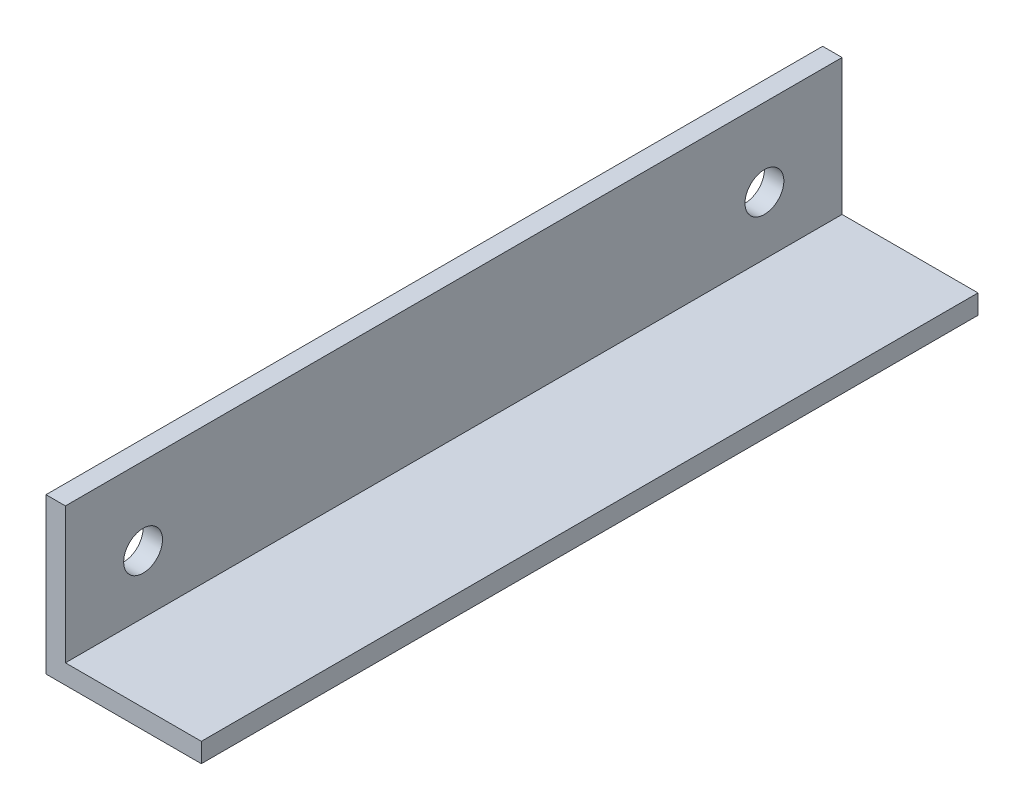
ISO-10303-21;
HEADER;
FILE_DESCRIPTION(('STEP AP214'),'2;1');
FILE_NAME('part.step','',(''),(''),'','','');
FILE_SCHEMA(('AUTOMOTIVE_DESIGN { 1 0 10303 214 1 1 1 1 }'));
ENDSEC;
DATA;
#1=APPLICATION_CONTEXT('core data for automotive mechanical design processes');
#2=APPLICATION_PROTOCOL_DEFINITION('international standard','automotive_design',2000,#1);
#3=PRODUCT_CONTEXT('',#1,'mechanical');
#4=PRODUCT('Part','Part','',(#3));
#5=PRODUCT_RELATED_PRODUCT_CATEGORY('part','',(#4));
#6=PRODUCT_DEFINITION_FORMATION('','',#4);
#7=PRODUCT_DEFINITION_CONTEXT('part definition',#1,'design');
#8=PRODUCT_DEFINITION('design','',#6,#7);
#9=PRODUCT_DEFINITION_SHAPE('','',#8);
#10=(LENGTH_UNIT() NAMED_UNIT(*) SI_UNIT(.MILLI.,.METRE.));
#11=(NAMED_UNIT(*) PLANE_ANGLE_UNIT() SI_UNIT($,.RADIAN.));
#12=(NAMED_UNIT(*) SI_UNIT($,.STERADIAN.) SOLID_ANGLE_UNIT());
#13=UNCERTAINTY_MEASURE_WITH_UNIT(LENGTH_MEASURE(1.E-05),#10,'distance_accuracy_value','');
#14=(GEOMETRIC_REPRESENTATION_CONTEXT(3) GLOBAL_UNCERTAINTY_ASSIGNED_CONTEXT((#13)) GLOBAL_UNIT_ASSIGNED_CONTEXT((#10,
#11,#12)) REPRESENTATION_CONTEXT('',''));
#15=CARTESIAN_POINT('',(0.,0.,0.));
#16=DIRECTION('',(0.,0.,1.));
#17=DIRECTION('',(1.,0.,0.));
#18=AXIS2_PLACEMENT_3D('',#15,#16,#17);
#19=CARTESIAN_POINT('',(6.50091407678245,3.175,63.5));
#20=DIRECTION('',(-1.,0.,0.));
#21=DIRECTION('',(0.,0.,1.));
#22=AXIS2_PLACEMENT_3D('',#19,#20,#21);
#23=PLANE('',#22);
#24=DIRECTION('',(0.,1.,0.));
#25=VECTOR('',#24,1.);
#26=CARTESIAN_POINT('',(6.50091407678245,3.175,-63.5));
#27=LINE('',#26,#25);
#28=CARTESIAN_POINT('',(6.50091407678245,0.,-63.5));
#29=VERTEX_POINT('',#28);
#30=CARTESIAN_POINT('',(6.50091407678245,3.175,-63.5));
#31=VERTEX_POINT('',#30);
#32=EDGE_CURVE('E117',#29,#31,#27,.T.);
#33=ORIENTED_EDGE('',*,*,#32,.T.);
#34=DIRECTION('',(0.,0.,-1.));
#35=VECTOR('',#34,1.);
#36=CARTESIAN_POINT('',(6.50091407678245,3.175,63.5));
#37=LINE('',#36,#35);
#38=CARTESIAN_POINT('',(6.50091407678245,3.175,63.5));
#39=VERTEX_POINT('',#38);
#40=EDGE_CURVE('E11',#39,#31,#37,.T.);
#41=ORIENTED_EDGE('',*,*,#40,.F.);
#42=DIRECTION('',(0.,1.,0.));
#43=VECTOR('',#42,1.);
#44=CARTESIAN_POINT('',(6.50091407678245,3.175,63.5));
#45=LINE('',#44,#43);
#46=CARTESIAN_POINT('',(6.50091407678245,0.,63.5));
#47=VERTEX_POINT('',#46);
#48=EDGE_CURVE('E128',#47,#39,#45,.T.);
#49=ORIENTED_EDGE('',*,*,#48,.F.);
#50=DIRECTION('',(0.,0.,-1.));
#51=VECTOR('',#50,1.);
#52=CARTESIAN_POINT('',(6.50091407678245,0.,63.5));
#53=LINE('',#52,#51);
#54=EDGE_CURVE('E113',#47,#29,#53,.T.);
#55=ORIENTED_EDGE('',*,*,#54,.T.);
#56=EDGE_LOOP('',(#33,#41,#49,#55));
#57=FACE_BOUND('',#56,.T.);
#58=ADVANCED_FACE('F33',(#57),#23,.F.);
#59=CARTESIAN_POINT('',(-15.7240859232176,3.17500000000001,63.5));
#60=DIRECTION('',(0.,-1.,0.));
#61=DIRECTION('',(1.,0.,0.));
#62=AXIS2_PLACEMENT_3D('',#59,#60,#61);
#63=PLANE('',#62);
#64=DIRECTION('',(-1.,0.,0.));
#65=VECTOR('',#64,1.);
#66=CARTESIAN_POINT('',(-15.7240859232176,3.17500000000001,-63.5));
#67=LINE('',#66,#65);
#68=CARTESIAN_POINT('',(-15.7240859232176,3.17500000000001,-63.5));
#69=VERTEX_POINT('',#68);
#70=EDGE_CURVE('E120',#31,#69,#67,.T.);
#71=ORIENTED_EDGE('',*,*,#70,.T.);
#72=DIRECTION('',(0.,0.,-1.));
#73=VECTOR('',#72,1.);
#74=CARTESIAN_POINT('',(-15.7240859232176,3.17500000000001,63.5));
#75=LINE('',#74,#73);
#76=CARTESIAN_POINT('',(-15.7240859232176,3.17500000000001,63.5));
#77=VERTEX_POINT('',#76);
#78=EDGE_CURVE('E41',#77,#69,#75,.T.);
#79=ORIENTED_EDGE('',*,*,#78,.F.);
#80=DIRECTION('',(-1.,0.,0.));
#81=VECTOR('',#80,1.);
#82=CARTESIAN_POINT('',(-15.7240859232176,3.17500000000001,63.5));
#83=LINE('',#82,#81);
#84=EDGE_CURVE('E86',#39,#77,#83,.T.);
#85=ORIENTED_EDGE('',*,*,#84,.F.);
#86=ORIENTED_EDGE('',*,*,#40,.T.);
#87=EDGE_LOOP('',(#71,#79,#85,#86));
#88=FACE_BOUND('',#87,.T.);
#89=ADVANCED_FACE('F154',(#88),#63,.F.);
#90=CARTESIAN_POINT('',(-15.7240859232176,25.4,63.5));
#91=DIRECTION('',(-1.,0.,0.));
#92=DIRECTION('',(0.,-1.,0.));
#93=AXIS2_PLACEMENT_3D('',#90,#91,#92);
#94=PLANE('',#93);
#95=CARTESIAN_POINT('',(-15.7240859232176,12.7,-50.8));
#96=DIRECTION('',(-1.,0.,0.));
#97=DIRECTION('',(0.,-1.,0.));
#98=AXIS2_PLACEMENT_3D('',#95,#96,#97);
#99=CIRCLE('',#98,3.175);
#100=CARTESIAN_POINT('',(-15.7240859232176,9.525,-50.8));
#101=VERTEX_POINT('',#100);
#102=EDGE_CURVE('E221',#101,#101,#99,.T.);
#103=ORIENTED_EDGE('',*,*,#102,.T.);
#104=EDGE_LOOP('',(#103));
#105=FACE_BOUND('',#104,.T.);
#106=CARTESIAN_POINT('',(-15.7240859232176,12.7,50.8));
#107=DIRECTION('',(-1.,0.,0.));
#108=DIRECTION('',(0.,-1.,0.));
#109=AXIS2_PLACEMENT_3D('',#106,#107,#108);
#110=CIRCLE('',#109,3.175);
#111=CARTESIAN_POINT('',(-15.7240859232176,9.525,50.8));
#112=VERTEX_POINT('',#111);
#113=EDGE_CURVE('E121',#112,#112,#110,.T.);
#114=ORIENTED_EDGE('',*,*,#113,.T.);
#115=EDGE_LOOP('',(#114));
#116=FACE_BOUND('',#115,.T.);
#117=DIRECTION('',(0.,1.,0.));
#118=VECTOR('',#117,1.);
#119=CARTESIAN_POINT('',(-15.7240859232176,25.4,-63.5));
#120=LINE('',#119,#118);
#121=CARTESIAN_POINT('',(-15.7240859232176,25.4,-63.5));
#122=VERTEX_POINT('',#121);
#123=EDGE_CURVE('E123',#69,#122,#120,.T.);
#124=ORIENTED_EDGE('',*,*,#123,.T.);
#125=DIRECTION('',(0.,0.,-1.));
#126=VECTOR('',#125,1.);
#127=CARTESIAN_POINT('',(-15.7240859232176,25.4,63.5));
#128=LINE('',#127,#126);
#129=CARTESIAN_POINT('',(-15.7240859232176,25.4,63.5));
#130=VERTEX_POINT('',#129);
#131=EDGE_CURVE('E108',#130,#122,#128,.T.);
#132=ORIENTED_EDGE('',*,*,#131,.F.);
#133=DIRECTION('',(0.,1.,0.));
#134=VECTOR('',#133,1.);
#135=CARTESIAN_POINT('',(-15.7240859232176,25.4,63.5));
#136=LINE('',#135,#134);
#137=EDGE_CURVE('E99',#77,#130,#136,.T.);
#138=ORIENTED_EDGE('',*,*,#137,.F.);
#139=ORIENTED_EDGE('',*,*,#78,.T.);
#140=EDGE_LOOP('',(#124,#132,#138,#139));
#141=FACE_BOUND('',#140,.T.);
#142=ADVANCED_FACE('F134',(#105,#116,#141),#94,.F.);
#143=CARTESIAN_POINT('',(-18.8990859232176,25.4,63.5));
#144=DIRECTION('',(0.,-1.,0.));
#145=DIRECTION('',(1.,0.,0.));
#146=AXIS2_PLACEMENT_3D('',#143,#144,#145);
#147=PLANE('',#146);
#148=DIRECTION('',(-1.,0.,0.));
#149=VECTOR('',#148,1.);
#150=CARTESIAN_POINT('',(-18.8990859232176,25.4,-63.5));
#151=LINE('',#150,#149);
#152=CARTESIAN_POINT('',(-18.8990859232176,25.4,-63.5));
#153=VERTEX_POINT('',#152);
#154=EDGE_CURVE('E107',#122,#153,#151,.T.);
#155=ORIENTED_EDGE('',*,*,#154,.T.);
#156=DIRECTION('',(0.,0.,-1.));
#157=VECTOR('',#156,1.);
#158=CARTESIAN_POINT('',(-18.8990859232176,25.4,63.5));
#159=LINE('',#158,#157);
#160=CARTESIAN_POINT('',(-18.8990859232176,25.4,63.5));
#161=VERTEX_POINT('',#160);
#162=EDGE_CURVE('E104',#161,#153,#159,.T.);
#163=ORIENTED_EDGE('',*,*,#162,.F.);
#164=DIRECTION('',(-1.,0.,0.));
#165=VECTOR('',#164,1.);
#166=CARTESIAN_POINT('',(-18.8990859232176,25.4,63.5));
#167=LINE('',#166,#165);
#168=EDGE_CURVE('E93',#130,#161,#167,.T.);
#169=ORIENTED_EDGE('',*,*,#168,.F.);
#170=ORIENTED_EDGE('',*,*,#131,.T.);
#171=EDGE_LOOP('',(#155,#163,#169,#170));
#172=FACE_BOUND('',#171,.T.);
#173=ADVANCED_FACE('F105',(#172),#147,.F.);
#174=CARTESIAN_POINT('',(-18.8990859232176,0.,63.5));
#175=DIRECTION('',(1.,0.,0.));
#176=DIRECTION('',(0.,0.,-1.));
#177=AXIS2_PLACEMENT_3D('',#174,#175,#176);
#178=PLANE('',#177);
#179=CARTESIAN_POINT('',(-18.8990859232176,12.7,-50.8));
#180=DIRECTION('',(-1.,0.,0.));
#181=DIRECTION('',(0.,0.,-1.));
#182=AXIS2_PLACEMENT_3D('',#179,#180,#181);
#183=CIRCLE('',#182,3.175);
#184=CARTESIAN_POINT('',(-18.8990859232176,12.7,-53.975));
#185=VERTEX_POINT('',#184);
#186=EDGE_CURVE('E218',#185,#185,#183,.T.);
#187=ORIENTED_EDGE('',*,*,#186,.F.);
#188=EDGE_LOOP('',(#187));
#189=FACE_BOUND('',#188,.T.);
#190=CARTESIAN_POINT('',(-18.8990859232176,12.7,50.8));
#191=DIRECTION('',(-1.,0.,0.));
#192=DIRECTION('',(0.,0.,1.));
#193=AXIS2_PLACEMENT_3D('',#190,#191,#192);
#194=CIRCLE('',#193,3.175);
#195=CARTESIAN_POINT('',(-18.8990859232176,12.7,53.975));
#196=VERTEX_POINT('',#195);
#197=EDGE_CURVE('E222',#196,#196,#194,.T.);
#198=ORIENTED_EDGE('',*,*,#197,.F.);
#199=EDGE_LOOP('',(#198));
#200=FACE_BOUND('',#199,.T.);
#201=DIRECTION('',(0.,-1.,0.));
#202=VECTOR('',#201,1.);
#203=CARTESIAN_POINT('',(-18.8990859232176,0.,-63.5));
#204=LINE('',#203,#202);
#205=CARTESIAN_POINT('',(-18.8990859232176,0.,-63.5));
#206=VERTEX_POINT('',#205);
#207=EDGE_CURVE('E72',#153,#206,#204,.T.);
#208=ORIENTED_EDGE('',*,*,#207,.T.);
#209=DIRECTION('',(0.,0.,-1.));
#210=VECTOR('',#209,1.);
#211=CARTESIAN_POINT('',(-18.8990859232176,0.,63.5));
#212=LINE('',#211,#210);
#213=CARTESIAN_POINT('',(-18.8990859232176,0.,63.5));
#214=VERTEX_POINT('',#213);
#215=EDGE_CURVE('E109',#214,#206,#212,.T.);
#216=ORIENTED_EDGE('',*,*,#215,.F.);
#217=DIRECTION('',(0.,-1.,0.));
#218=VECTOR('',#217,1.);
#219=CARTESIAN_POINT('',(-18.8990859232176,0.,63.5));
#220=LINE('',#219,#218);
#221=EDGE_CURVE('E97',#161,#214,#220,.T.);
#222=ORIENTED_EDGE('',*,*,#221,.F.);
#223=ORIENTED_EDGE('',*,*,#162,.T.);
#224=EDGE_LOOP('',(#208,#216,#222,#223));
#225=FACE_BOUND('',#224,.T.);
#226=ADVANCED_FACE('F111',(#189,#200,#225),#178,.F.);
#227=CARTESIAN_POINT('',(6.50091407678245,0.,63.5));
#228=DIRECTION('',(0.,1.,0.));
#229=DIRECTION('',(-1.,0.,0.));
#230=AXIS2_PLACEMENT_3D('',#227,#228,#229);
#231=PLANE('',#230);
#232=DIRECTION('',(1.,0.,0.));
#233=VECTOR('',#232,1.);
#234=CARTESIAN_POINT('',(6.50091407678245,0.,-63.5));
#235=LINE('',#234,#233);
#236=EDGE_CURVE('E78',#206,#29,#235,.T.);
#237=ORIENTED_EDGE('',*,*,#236,.T.);
#238=ORIENTED_EDGE('',*,*,#54,.F.);
#239=DIRECTION('',(1.,0.,0.));
#240=VECTOR('',#239,1.);
#241=CARTESIAN_POINT('',(6.50091407678245,0.,63.5));
#242=LINE('',#241,#240);
#243=EDGE_CURVE('E49',#214,#47,#242,.T.);
#244=ORIENTED_EDGE('',*,*,#243,.F.);
#245=ORIENTED_EDGE('',*,*,#215,.T.);
#246=EDGE_LOOP('',(#237,#238,#244,#245));
#247=FACE_BOUND('',#246,.T.);
#248=ADVANCED_FACE('F141',(#247),#231,.F.);
#249=CARTESIAN_POINT('',(0.,0.,63.5));
#250=DIRECTION('',(0.,0.,-1.));
#251=DIRECTION('',(-1.,0.,0.));
#252=AXIS2_PLACEMENT_3D('',#249,#250,#251);
#253=PLANE('',#252);
#254=ORIENTED_EDGE('',*,*,#48,.T.);
#255=ORIENTED_EDGE('',*,*,#84,.T.);
#256=ORIENTED_EDGE('',*,*,#137,.T.);
#257=ORIENTED_EDGE('',*,*,#168,.T.);
#258=ORIENTED_EDGE('',*,*,#221,.T.);
#259=ORIENTED_EDGE('',*,*,#243,.T.);
#260=EDGE_LOOP('',(#254,#255,#256,#257,#258,#259));
#261=FACE_BOUND('',#260,.T.);
#262=ADVANCED_FACE('F95',(#261),#253,.F.);
#263=CARTESIAN_POINT('',(0.,0.,-63.5));
#264=DIRECTION('',(0.,0.,-1.));
#265=DIRECTION('',(-1.,0.,0.));
#266=AXIS2_PLACEMENT_3D('',#263,#264,#265);
#267=PLANE('',#266);
#268=ORIENTED_EDGE('',*,*,#32,.F.);
#269=ORIENTED_EDGE('',*,*,#236,.F.);
#270=ORIENTED_EDGE('',*,*,#207,.F.);
#271=ORIENTED_EDGE('',*,*,#154,.F.);
#272=ORIENTED_EDGE('',*,*,#123,.F.);
#273=ORIENTED_EDGE('',*,*,#70,.F.);
#274=EDGE_LOOP('',(#268,#269,#270,#271,#272,#273));
#275=FACE_BOUND('',#274,.T.);
#276=ADVANCED_FACE('F137',(#275),#267,.T.);
#277=CARTESIAN_POINT('',(108.100914076782,12.7,50.8));
#278=DIRECTION('',(-1.,0.,0.));
#279=DIRECTION('',(0.,0.,1.));
#280=AXIS2_PLACEMENT_3D('',#277,#278,#279);
#281=CYLINDRICAL_SURFACE('',#280,3.175);
#282=ORIENTED_EDGE('',*,*,#197,.T.);
#283=EDGE_LOOP('',(#282));
#284=FACE_BOUND('',#283,.T.);
#285=ORIENTED_EDGE('',*,*,#113,.F.);
#286=EDGE_LOOP('',(#285));
#287=FACE_BOUND('',#286,.T.);
#288=ADVANCED_FACE('F181',(#284,#287),#281,.F.);
#289=CARTESIAN_POINT('',(108.100914076782,12.7,-50.8));
#290=DIRECTION('',(-1.,0.,0.));
#291=DIRECTION('',(0.,0.,1.));
#292=AXIS2_PLACEMENT_3D('',#289,#290,#291);
#293=CYLINDRICAL_SURFACE('',#292,3.175);
#294=ORIENTED_EDGE('',*,*,#186,.T.);
#295=EDGE_LOOP('',(#294));
#296=FACE_BOUND('',#295,.T.);
#297=ORIENTED_EDGE('',*,*,#102,.F.);
#298=EDGE_LOOP('',(#297));
#299=FACE_BOUND('',#298,.T.);
#300=ADVANCED_FACE('F186',(#296,#299),#293,.F.);
#301=CLOSED_SHELL('',(#58,#89,#142,#173,#226,#248,#262,#276,#288,#300));
#302=MANIFOLD_SOLID_BREP('B2',#301);
#303=ADVANCED_BREP_SHAPE_REPRESENTATION('',(#18,#302),#14);
#304=SHAPE_DEFINITION_REPRESENTATION(#9,#303);
ENDSEC;
END-ISO-10303-21;
